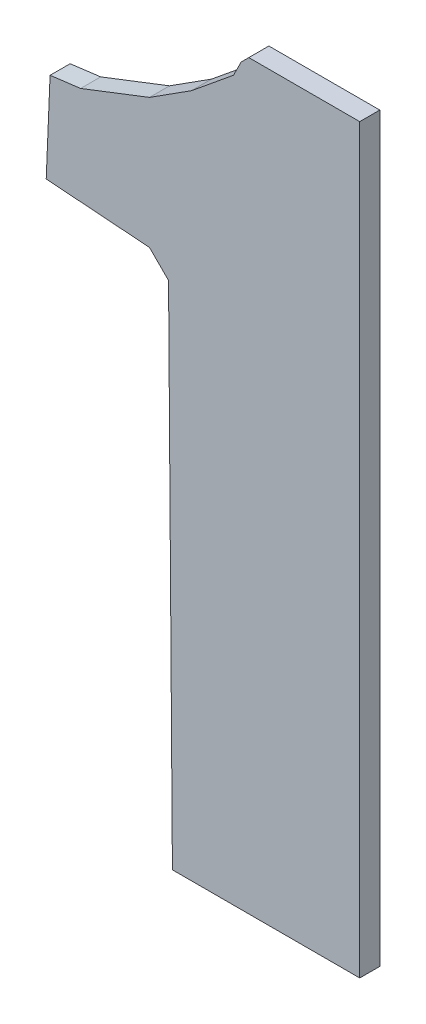
ISO-10303-21;
HEADER;
FILE_DESCRIPTION(('STEP AP214'),'2;1');
FILE_NAME('part.step','',(''),(''),'','','');
FILE_SCHEMA(('AUTOMOTIVE_DESIGN { 1 0 10303 214 1 1 1 1 }'));
ENDSEC;
DATA;
#1=APPLICATION_CONTEXT('core data for automotive mechanical design processes');
#2=APPLICATION_PROTOCOL_DEFINITION('international standard','automotive_design',2000,#1);
#3=PRODUCT_CONTEXT('',#1,'mechanical');
#4=PRODUCT('Part','Part','',(#3));
#5=PRODUCT_RELATED_PRODUCT_CATEGORY('part','',(#4));
#6=PRODUCT_DEFINITION_FORMATION('','',#4);
#7=PRODUCT_DEFINITION_CONTEXT('part definition',#1,'design');
#8=PRODUCT_DEFINITION('design','',#6,#7);
#9=PRODUCT_DEFINITION_SHAPE('','',#8);
#10=(LENGTH_UNIT() NAMED_UNIT(*) SI_UNIT(.MILLI.,.METRE.));
#11=(NAMED_UNIT(*) PLANE_ANGLE_UNIT() SI_UNIT($,.RADIAN.));
#12=(NAMED_UNIT(*) SI_UNIT($,.STERADIAN.) SOLID_ANGLE_UNIT());
#13=UNCERTAINTY_MEASURE_WITH_UNIT(LENGTH_MEASURE(1.E-05),#10,'distance_accuracy_value','');
#14=(GEOMETRIC_REPRESENTATION_CONTEXT(3) GLOBAL_UNCERTAINTY_ASSIGNED_CONTEXT((#13)) GLOBAL_UNIT_ASSIGNED_CONTEXT((#10,
#11,#12)) REPRESENTATION_CONTEXT('',''));
#15=CARTESIAN_POINT('',(0.,0.,0.));
#16=DIRECTION('',(0.,0.,1.));
#17=DIRECTION('',(1.,0.,0.));
#18=AXIS2_PLACEMENT_3D('',#15,#16,#17);
#19=CARTESIAN_POINT('',(0.,0.,0.05));
#20=DIRECTION('',(0.,0.,1.));
#21=DIRECTION('',(1.,0.,0.));
#22=AXIS2_PLACEMENT_3D('',#19,#20,#21);
#23=PLANE('',#22);
#24=DIRECTION('',(-0.842902467487739,-0.538066380944844,0.));
#25=VECTOR('',#24,1.);
#26=CARTESIAN_POINT('',(-0.67691,0.910336,0.05));
#27=LINE('',#26,#25);
#28=CARTESIAN_POINT('',(-0.676910000000001,0.910336000000001,0.05));
#29=VERTEX_POINT('',#28);
#30=CARTESIAN_POINT('',(-0.781558,0.843534000000001,0.05));
#31=VERTEX_POINT('',#30);
#32=EDGE_CURVE('E135',#29,#31,#27,.T.);
#33=ORIENTED_EDGE('',*,*,#32,.T.);
#34=DIRECTION('',(-0.932418227921284,-0.361381029164694,0.));
#35=VECTOR('',#34,1.);
#36=CARTESIAN_POINT('',(-0.781558,0.843534,0.05));
#37=LINE('',#36,#35);
#38=CARTESIAN_POINT('',(-0.953262000000001,0.776986000000003,0.05));
#39=VERTEX_POINT('',#38);
#40=EDGE_CURVE('E137',#39,#31,#37,.F.);
#41=ORIENTED_EDGE('',*,*,#40,.F.);
#42=DIRECTION('',(-0.992073039017614,-0.125662584942202,0.));
#43=VECTOR('',#42,1.);
#44=CARTESIAN_POINT('',(-0.953262,0.776986,0.05));
#45=LINE('',#44,#43);
#46=CARTESIAN_POINT('',(-1.029462,0.767334000000001,0.05));
#47=VERTEX_POINT('',#46);
#48=EDGE_CURVE('E140',#47,#39,#45,.F.);
#49=ORIENTED_EDGE('',*,*,#48,.F.);
#50=DIRECTION('',(-0.0421379007327119,-0.999111804215044,0.));
#51=VECTOR('',#50,1.);
#52=CARTESIAN_POINT('',(-1.029462,0.767334,0.05));
#53=LINE('',#52,#51);
#54=CARTESIAN_POINT('',(-1.039114,0.53848,0.05));
#55=VERTEX_POINT('',#54);
#56=EDGE_CURVE('E144',#55,#47,#53,.F.);
#57=ORIENTED_EDGE('',*,*,#56,.F.);
#58=DIRECTION('',(0.997275799066995,-0.0737630028895696,0.));
#59=VECTOR('',#58,1.);
#60=CARTESIAN_POINT('',(-1.039114,0.53848,0.05));
#61=LINE('',#60,#59);
#62=CARTESIAN_POINT('',(-0.781558,0.51943,0.05));
#63=VERTEX_POINT('',#62);
#64=EDGE_CURVE('E148',#63,#55,#61,.F.);
#65=ORIENTED_EDGE('',*,*,#64,.F.);
#66=DIRECTION('',(0.707106781186548,-0.707106781186548,0.));
#67=VECTOR('',#66,1.);
#68=CARTESIAN_POINT('',(-0.781558,0.51943,0.05));
#69=LINE('',#68,#67);
#70=CARTESIAN_POINT('',(-0.73406,0.471932,0.05));
#71=VERTEX_POINT('',#70);
#72=EDGE_CURVE('E152',#71,#63,#69,.F.);
#73=ORIENTED_EDGE('',*,*,#72,.F.);
#74=DIRECTION('',(0.0076119589518409,-0.999971028620787,0.));
#75=VECTOR('',#74,1.);
#76=CARTESIAN_POINT('',(-0.73406,0.471932,0.05));
#77=LINE('',#76,#75);
#78=CARTESIAN_POINT('',(-0.724408,-0.796036,0.05));
#79=VERTEX_POINT('',#78);
#80=EDGE_CURVE('E156',#79,#71,#77,.F.);
#81=ORIENTED_EDGE('',*,*,#80,.F.);
#82=DIRECTION('',(1.,0.,0.));
#83=VECTOR('',#82,1.);
#84=CARTESIAN_POINT('',(-0.724408,-0.796036,0.05));
#85=LINE('',#84,#83);
#86=CARTESIAN_POINT('',(-0.257302,-0.796036,0.05));
#87=VERTEX_POINT('',#86);
#88=EDGE_CURVE('E160',#87,#79,#85,.F.);
#89=ORIENTED_EDGE('',*,*,#88,.F.);
#90=DIRECTION('',(0.,1.,0.));
#91=VECTOR('',#90,1.);
#92=CARTESIAN_POINT('',(-0.257302,-0.796036,0.05));
#93=LINE('',#92,#91);
#94=CARTESIAN_POINT('',(-0.257302,1.053338,0.05));
#95=VERTEX_POINT('',#94);
#96=EDGE_CURVE('E114',#95,#87,#93,.F.);
#97=ORIENTED_EDGE('',*,*,#96,.F.);
#98=DIRECTION('',(1.,0.,0.));
#99=VECTOR('',#98,1.);
#100=CARTESIAN_POINT('',(0.,1.053338,0.05));
#101=LINE('',#100,#99);
#102=CARTESIAN_POINT('',(-0.533908,1.053338,0.05));
#103=VERTEX_POINT('',#102);
#104=EDGE_CURVE('E20',#95,#103,#101,.F.);
#105=ORIENTED_EDGE('',*,*,#104,.T.);
#106=DIRECTION('',(-0.707106781186545,-0.70710678118655,0.));
#107=VECTOR('',#106,1.);
#108=CARTESIAN_POINT('',(-0.533908,1.053338,0.05));
#109=LINE('',#108,#107);
#110=CARTESIAN_POINT('',(-0.552958,1.034288,0.05));
#111=VERTEX_POINT('',#110);
#112=EDGE_CURVE('E109',#103,#111,#109,.T.);
#113=ORIENTED_EDGE('',*,*,#112,.T.);
#114=DIRECTION('',(-0.447213595499956,-0.894427190999917,0.));
#115=VECTOR('',#114,1.);
#116=CARTESIAN_POINT('',(-0.552958,1.034288,0.05));
#117=LINE('',#116,#115);
#118=CARTESIAN_POINT('',(-0.572008,0.996188,0.05));
#119=VERTEX_POINT('',#118);
#120=EDGE_CURVE('E130',#111,#119,#117,.T.);
#121=ORIENTED_EDGE('',*,*,#120,.T.);
#122=DIRECTION('',(-0.773873806941793,-0.633339822630329,0.));
#123=VECTOR('',#122,1.);
#124=CARTESIAN_POINT('',(-0.572008,0.996188,0.05));
#125=LINE('',#124,#123);
#126=EDGE_CURVE('E131',#119,#29,#125,.T.);
#127=ORIENTED_EDGE('',*,*,#126,.T.);
#128=EDGE_LOOP('',(#33,#41,#49,#57,#65,#73,#81,#89,#97,#105,#113,#121,#127));
#129=FACE_BOUND('',#128,.T.);
#130=ADVANCED_FACE('F17',(#129),#23,.T.);
#131=CARTESIAN_POINT('',(-0.781558,0.843534,0.));
#132=DIRECTION('',(-0.361381029164694,0.932418227921284,0.));
#133=DIRECTION('',(-0.932418227921284,-0.361381029164694,0.));
#134=AXIS2_PLACEMENT_3D('',#131,#132,#133);
#135=PLANE('',#134);
#136=DIRECTION('',(0.,0.,1.));
#137=VECTOR('',#136,1.);
#138=CARTESIAN_POINT('',(-0.781558000000001,0.843534000000002,0.));
#139=LINE('',#138,#137);
#140=CARTESIAN_POINT('',(-0.781558000000001,0.843534,0.));
#141=VERTEX_POINT('',#140);
#142=EDGE_CURVE('E171',#141,#31,#139,.T.);
#143=ORIENTED_EDGE('',*,*,#142,.F.);
#144=DIRECTION('',(-0.932418227921262,-0.36138102916475,0.));
#145=VECTOR('',#144,1.);
#146=CARTESIAN_POINT('',(-0.781558,0.843534,0.));
#147=LINE('',#146,#145);
#148=CARTESIAN_POINT('',(-0.953262000000002,0.776986000000005,0.));
#149=VERTEX_POINT('',#148);
#150=EDGE_CURVE('E175',#141,#149,#147,.T.);
#151=ORIENTED_EDGE('',*,*,#150,.T.);
#152=DIRECTION('',(0.,0.,1.));
#153=VECTOR('',#152,1.);
#154=CARTESIAN_POINT('',(-0.953262,0.776986,0.));
#155=LINE('',#154,#153);
#156=EDGE_CURVE('E142',#39,#149,#155,.F.);
#157=ORIENTED_EDGE('',*,*,#156,.F.);
#158=ORIENTED_EDGE('',*,*,#40,.T.);
#159=EDGE_LOOP('',(#143,#151,#157,#158));
#160=FACE_BOUND('',#159,.T.);
#161=ADVANCED_FACE('F221',(#160),#135,.T.);
#162=CARTESIAN_POINT('',(-0.953262,0.776986,0.));
#163=DIRECTION('',(-0.125662584942202,0.992073039017614,0.));
#164=DIRECTION('',(-0.992073039017614,-0.125662584942202,0.));
#165=AXIS2_PLACEMENT_3D('',#162,#163,#164);
#166=PLANE('',#165);
#167=ORIENTED_EDGE('',*,*,#156,.T.);
#168=DIRECTION('',(-0.99207303901761,-0.125662584942232,0.));
#169=VECTOR('',#168,1.);
#170=CARTESIAN_POINT('',(-0.953262,0.776986,0.));
#171=LINE('',#170,#169);
#172=CARTESIAN_POINT('',(-1.029462,0.767334000000001,0.));
#173=VERTEX_POINT('',#172);
#174=EDGE_CURVE('E178',#149,#173,#171,.T.);
#175=ORIENTED_EDGE('',*,*,#174,.T.);
#176=DIRECTION('',(0.,0.,1.));
#177=VECTOR('',#176,1.);
#178=CARTESIAN_POINT('',(-1.029462,0.767334,0.));
#179=LINE('',#178,#177);
#180=EDGE_CURVE('E146',#47,#173,#179,.F.);
#181=ORIENTED_EDGE('',*,*,#180,.F.);
#182=ORIENTED_EDGE('',*,*,#48,.T.);
#183=EDGE_LOOP('',(#167,#175,#181,#182));
#184=FACE_BOUND('',#183,.T.);
#185=ADVANCED_FACE('F262',(#184),#166,.T.);
#186=CARTESIAN_POINT('',(-1.029462,0.767334,0.));
#187=DIRECTION('',(-0.999111804215044,0.0421379007327119,0.));
#188=DIRECTION('',(-0.0421379007327119,-0.999111804215044,0.));
#189=AXIS2_PLACEMENT_3D('',#186,#187,#188);
#190=PLANE('',#189);
#191=ORIENTED_EDGE('',*,*,#180,.T.);
#192=DIRECTION('',(-0.0421379007327098,-0.999111804215044,0.));
#193=VECTOR('',#192,1.);
#194=CARTESIAN_POINT('',(-1.029462,0.767334,0.));
#195=LINE('',#194,#193);
#196=CARTESIAN_POINT('',(-1.039114,0.53848,0.));
#197=VERTEX_POINT('',#196);
#198=EDGE_CURVE('E181',#173,#197,#195,.T.);
#199=ORIENTED_EDGE('',*,*,#198,.T.);
#200=DIRECTION('',(0.,0.,1.));
#201=VECTOR('',#200,1.);
#202=CARTESIAN_POINT('',(-1.039114,0.53848,0.));
#203=LINE('',#202,#201);
#204=EDGE_CURVE('E150',#55,#197,#203,.F.);
#205=ORIENTED_EDGE('',*,*,#204,.F.);
#206=ORIENTED_EDGE('',*,*,#56,.T.);
#207=EDGE_LOOP('',(#191,#199,#205,#206));
#208=FACE_BOUND('',#207,.T.);
#209=ADVANCED_FACE('F258',(#208),#190,.T.);
#210=CARTESIAN_POINT('',(-1.039114,0.53848,0.));
#211=DIRECTION('',(-0.0737630028895696,-0.997275799066995,0.));
#212=DIRECTION('',(0.997275799066995,-0.0737630028895696,0.));
#213=AXIS2_PLACEMENT_3D('',#210,#211,#212);
#214=PLANE('',#213);
#215=ORIENTED_EDGE('',*,*,#204,.T.);
#216=DIRECTION('',(0.997275799066995,-0.0737630028895704,0.));
#217=VECTOR('',#216,1.);
#218=CARTESIAN_POINT('',(-1.039114,0.53848,0.));
#219=LINE('',#218,#217);
#220=CARTESIAN_POINT('',(-0.781558,0.51943,0.));
#221=VERTEX_POINT('',#220);
#222=EDGE_CURVE('E184',#197,#221,#219,.T.);
#223=ORIENTED_EDGE('',*,*,#222,.T.);
#224=DIRECTION('',(0.,0.,1.));
#225=VECTOR('',#224,1.);
#226=CARTESIAN_POINT('',(-0.781558,0.51943,0.));
#227=LINE('',#226,#225);
#228=EDGE_CURVE('E154',#63,#221,#227,.F.);
#229=ORIENTED_EDGE('',*,*,#228,.F.);
#230=ORIENTED_EDGE('',*,*,#64,.T.);
#231=EDGE_LOOP('',(#215,#223,#229,#230));
#232=FACE_BOUND('',#231,.T.);
#233=ADVANCED_FACE('F254',(#232),#214,.T.);
#234=CARTESIAN_POINT('',(-0.781558,0.51943,0.));
#235=DIRECTION('',(-0.707106781186548,-0.707106781186548,0.));
#236=DIRECTION('',(0.707106781186548,-0.707106781186548,0.));
#237=AXIS2_PLACEMENT_3D('',#234,#235,#236);
#238=PLANE('',#237);
#239=ORIENTED_EDGE('',*,*,#228,.T.);
#240=DIRECTION('',(0.707106781186548,-0.707106781186547,0.));
#241=VECTOR('',#240,1.);
#242=CARTESIAN_POINT('',(-0.781558,0.51943,0.));
#243=LINE('',#242,#241);
#244=CARTESIAN_POINT('',(-0.73406,0.471932,0.));
#245=VERTEX_POINT('',#244);
#246=EDGE_CURVE('E187',#221,#245,#243,.T.);
#247=ORIENTED_EDGE('',*,*,#246,.T.);
#248=DIRECTION('',(0.,0.,1.));
#249=VECTOR('',#248,1.);
#250=CARTESIAN_POINT('',(-0.73406,0.471932,0.));
#251=LINE('',#250,#249);
#252=EDGE_CURVE('E158',#71,#245,#251,.F.);
#253=ORIENTED_EDGE('',*,*,#252,.F.);
#254=ORIENTED_EDGE('',*,*,#72,.T.);
#255=EDGE_LOOP('',(#239,#247,#253,#254));
#256=FACE_BOUND('',#255,.T.);
#257=ADVANCED_FACE('F250',(#256),#238,.T.);
#258=CARTESIAN_POINT('',(-0.73406,0.471932,0.));
#259=DIRECTION('',(-0.999971028620787,-0.0076119589518409,0.));
#260=DIRECTION('',(0.0076119589518409,-0.999971028620787,0.));
#261=AXIS2_PLACEMENT_3D('',#258,#259,#260);
#262=PLANE('',#261);
#263=ORIENTED_EDGE('',*,*,#252,.T.);
#264=DIRECTION('',(0.0076119589518409,-0.999971028620787,0.));
#265=VECTOR('',#264,1.);
#266=CARTESIAN_POINT('',(-0.73406,0.471932,0.));
#267=LINE('',#266,#265);
#268=CARTESIAN_POINT('',(-0.724408,-0.796036,0.));
#269=VERTEX_POINT('',#268);
#270=EDGE_CURVE('E190',#245,#269,#267,.T.);
#271=ORIENTED_EDGE('',*,*,#270,.T.);
#272=DIRECTION('',(0.,0.,-1.));
#273=VECTOR('',#272,1.);
#274=CARTESIAN_POINT('',(-0.724408,-0.796036,0.));
#275=LINE('',#274,#273);
#276=EDGE_CURVE('E162',#79,#269,#275,.T.);
#277=ORIENTED_EDGE('',*,*,#276,.F.);
#278=ORIENTED_EDGE('',*,*,#80,.T.);
#279=EDGE_LOOP('',(#263,#271,#277,#278));
#280=FACE_BOUND('',#279,.T.);
#281=ADVANCED_FACE('F246',(#280),#262,.T.);
#282=CARTESIAN_POINT('',(-0.724408,-0.796036,0.));
#283=DIRECTION('',(0.,-1.,0.));
#284=DIRECTION('',(0.,0.,-1.));
#285=AXIS2_PLACEMENT_3D('',#282,#283,#284);
#286=PLANE('',#285);
#287=ORIENTED_EDGE('',*,*,#276,.T.);
#288=DIRECTION('',(1.,0.,0.));
#289=VECTOR('',#288,1.);
#290=CARTESIAN_POINT('',(0.,-0.796036,0.));
#291=LINE('',#290,#289);
#292=CARTESIAN_POINT('',(-0.257302,-0.796036,0.));
#293=VERTEX_POINT('',#292);
#294=EDGE_CURVE('E193',#269,#293,#291,.T.);
#295=ORIENTED_EDGE('',*,*,#294,.T.);
#296=DIRECTION('',(0.,0.,-1.));
#297=VECTOR('',#296,1.);
#298=CARTESIAN_POINT('',(-0.257302,-0.796036,0.));
#299=LINE('',#298,#297);
#300=EDGE_CURVE('E165',#87,#293,#299,.T.);
#301=ORIENTED_EDGE('',*,*,#300,.F.);
#302=ORIENTED_EDGE('',*,*,#88,.T.);
#303=EDGE_LOOP('',(#287,#295,#301,#302));
#304=FACE_BOUND('',#303,.T.);
#305=ADVANCED_FACE('F242',(#304),#286,.T.);
#306=CARTESIAN_POINT('',(-0.257302,-0.796036,0.));
#307=DIRECTION('',(1.,0.,0.));
#308=DIRECTION('',(0.,0.,-1.));
#309=AXIS2_PLACEMENT_3D('',#306,#307,#308);
#310=PLANE('',#309);
#311=ORIENTED_EDGE('',*,*,#300,.T.);
#312=DIRECTION('',(0.,1.,0.));
#313=VECTOR('',#312,1.);
#314=CARTESIAN_POINT('',(-0.257302,0.,0.));
#315=LINE('',#314,#313);
#316=CARTESIAN_POINT('',(-0.257302,1.053338,0.));
#317=VERTEX_POINT('',#316);
#318=EDGE_CURVE('E196',#293,#317,#315,.T.);
#319=ORIENTED_EDGE('',*,*,#318,.T.);
#320=DIRECTION('',(0.,0.,1.));
#321=VECTOR('',#320,1.);
#322=CARTESIAN_POINT('',(-0.257302,1.053338,0.));
#323=LINE('',#322,#321);
#324=EDGE_CURVE('E126',#95,#317,#323,.F.);
#325=ORIENTED_EDGE('',*,*,#324,.F.);
#326=ORIENTED_EDGE('',*,*,#96,.T.);
#327=EDGE_LOOP('',(#311,#319,#325,#326));
#328=FACE_BOUND('',#327,.T.);
#329=ADVANCED_FACE('F239',(#328),#310,.T.);
#330=CARTESIAN_POINT('',(-0.257302,1.053338,0.));
#331=DIRECTION('',(0.,1.,0.));
#332=DIRECTION('',(0.,0.,1.));
#333=AXIS2_PLACEMENT_3D('',#330,#331,#332);
#334=PLANE('',#333);
#335=ORIENTED_EDGE('',*,*,#324,.T.);
#336=DIRECTION('',(1.,0.,0.));
#337=VECTOR('',#336,1.);
#338=CARTESIAN_POINT('',(0.,1.053338,0.));
#339=LINE('',#338,#337);
#340=CARTESIAN_POINT('',(-0.533908,1.053338,0.));
#341=VERTEX_POINT('',#340);
#342=EDGE_CURVE('E121',#317,#341,#339,.F.);
#343=ORIENTED_EDGE('',*,*,#342,.T.);
#344=DIRECTION('',(0.,0.,1.));
#345=VECTOR('',#344,1.);
#346=CARTESIAN_POINT('',(-0.533908,1.053338,0.));
#347=LINE('',#346,#345);
#348=EDGE_CURVE('E118',#103,#341,#347,.F.);
#349=ORIENTED_EDGE('',*,*,#348,.F.);
#350=ORIENTED_EDGE('',*,*,#104,.F.);
#351=EDGE_LOOP('',(#335,#343,#349,#350));
#352=FACE_BOUND('',#351,.T.);
#353=ADVANCED_FACE('F119',(#352),#334,.T.);
#354=CARTESIAN_POINT('',(-0.533908,1.053338,0.));
#355=DIRECTION('',(-0.707106781186548,0.707106781186548,0.));
#356=DIRECTION('',(-0.707106781186548,-0.707106781186548,0.));
#357=AXIS2_PLACEMENT_3D('',#354,#355,#356);
#358=PLANE('',#357);
#359=ORIENTED_EDGE('',*,*,#348,.T.);
#360=DIRECTION('',(-0.707106781186545,-0.70710678118655,0.));
#361=VECTOR('',#360,1.);
#362=CARTESIAN_POINT('',(-0.533908,1.053338,0.));
#363=LINE('',#362,#361);
#364=CARTESIAN_POINT('',(-0.552958,1.034288,0.));
#365=VERTEX_POINT('',#364);
#366=EDGE_CURVE('E200',#341,#365,#363,.T.);
#367=ORIENTED_EDGE('',*,*,#366,.T.);
#368=DIRECTION('',(0.,0.,1.));
#369=VECTOR('',#368,1.);
#370=CARTESIAN_POINT('',(-0.552958,1.034288,0.));
#371=LINE('',#370,#369);
#372=EDGE_CURVE('E125',#111,#365,#371,.F.);
#373=ORIENTED_EDGE('',*,*,#372,.F.);
#374=ORIENTED_EDGE('',*,*,#112,.F.);
#375=EDGE_LOOP('',(#359,#367,#373,#374));
#376=FACE_BOUND('',#375,.T.);
#377=ADVANCED_FACE('F128',(#376),#358,.T.);
#378=CARTESIAN_POINT('',(-0.552958,1.034288,0.));
#379=DIRECTION('',(-0.894427190999896,0.447213595499998,0.));
#380=DIRECTION('',(-0.447213595499998,-0.894427190999896,0.));
#381=AXIS2_PLACEMENT_3D('',#378,#379,#380);
#382=PLANE('',#381);
#383=ORIENTED_EDGE('',*,*,#372,.T.);
#384=DIRECTION('',(-0.447213595499956,-0.894427190999917,0.));
#385=VECTOR('',#384,1.);
#386=CARTESIAN_POINT('',(-0.552958,1.034288,0.));
#387=LINE('',#386,#385);
#388=CARTESIAN_POINT('',(-0.572008000000001,0.996188000000001,0.));
#389=VERTEX_POINT('',#388);
#390=EDGE_CURVE('E202',#365,#389,#387,.T.);
#391=ORIENTED_EDGE('',*,*,#390,.T.);
#392=DIRECTION('',(0.,0.,1.));
#393=VECTOR('',#392,1.);
#394=CARTESIAN_POINT('',(-0.572008,0.996188,0.));
#395=LINE('',#394,#393);
#396=EDGE_CURVE('E169',#119,#389,#395,.F.);
#397=ORIENTED_EDGE('',*,*,#396,.F.);
#398=ORIENTED_EDGE('',*,*,#120,.F.);
#399=EDGE_LOOP('',(#383,#391,#397,#398));
#400=FACE_BOUND('',#399,.T.);
#401=ADVANCED_FACE('F215',(#400),#382,.T.);
#402=CARTESIAN_POINT('',(-0.572008,0.996188,0.));
#403=DIRECTION('',(-0.633339822630308,0.77387380694181,0.));
#404=DIRECTION('',(-0.77387380694181,-0.633339822630308,0.));
#405=AXIS2_PLACEMENT_3D('',#402,#403,#404);
#406=PLANE('',#405);
#407=ORIENTED_EDGE('',*,*,#396,.T.);
#408=DIRECTION('',(-0.773873806941793,-0.633339822630329,0.));
#409=VECTOR('',#408,1.);
#410=CARTESIAN_POINT('',(-0.572008,0.996188,0.));
#411=LINE('',#410,#409);
#412=CARTESIAN_POINT('',(-0.676910000000001,0.910336000000001,0.));
#413=VERTEX_POINT('',#412);
#414=EDGE_CURVE('E26',#389,#413,#411,.T.);
#415=ORIENTED_EDGE('',*,*,#414,.T.);
#416=DIRECTION('',(0.,0.,1.));
#417=VECTOR('',#416,1.);
#418=CARTESIAN_POINT('',(-0.67691,0.910336,0.));
#419=LINE('',#418,#417);
#420=EDGE_CURVE('E34',#29,#413,#419,.F.);
#421=ORIENTED_EDGE('',*,*,#420,.F.);
#422=ORIENTED_EDGE('',*,*,#126,.F.);
#423=EDGE_LOOP('',(#407,#415,#421,#422));
#424=FACE_BOUND('',#423,.T.);
#425=ADVANCED_FACE('F208',(#424),#406,.T.);
#426=CARTESIAN_POINT('',(-0.67691,0.910336,0.));
#427=DIRECTION('',(-0.53806638094483,0.842902467487747,0.));
#428=DIRECTION('',(-0.842902467487747,-0.53806638094483,0.));
#429=AXIS2_PLACEMENT_3D('',#426,#427,#428);
#430=PLANE('',#429);
#431=ORIENTED_EDGE('',*,*,#420,.T.);
#432=DIRECTION('',(-0.842902467487739,-0.538066380944844,0.));
#433=VECTOR('',#432,1.);
#434=CARTESIAN_POINT('',(-0.67691,0.910336,0.));
#435=LINE('',#434,#433);
#436=EDGE_CURVE('E11',#413,#141,#435,.T.);
#437=ORIENTED_EDGE('',*,*,#436,.T.);
#438=ORIENTED_EDGE('',*,*,#142,.T.);
#439=ORIENTED_EDGE('',*,*,#32,.F.);
#440=EDGE_LOOP('',(#431,#437,#438,#439));
#441=FACE_BOUND('',#440,.T.);
#442=ADVANCED_FACE('F222',(#441),#430,.T.);
#443=CARTESIAN_POINT('',(0.,0.,0.));
#444=DIRECTION('',(0.,0.,1.));
#445=DIRECTION('',(1.,0.,0.));
#446=AXIS2_PLACEMENT_3D('',#443,#444,#445);
#447=PLANE('',#446);
#448=ORIENTED_EDGE('',*,*,#414,.F.);
#449=ORIENTED_EDGE('',*,*,#390,.F.);
#450=ORIENTED_EDGE('',*,*,#366,.F.);
#451=ORIENTED_EDGE('',*,*,#342,.F.);
#452=ORIENTED_EDGE('',*,*,#318,.F.);
#453=ORIENTED_EDGE('',*,*,#294,.F.);
#454=ORIENTED_EDGE('',*,*,#270,.F.);
#455=ORIENTED_EDGE('',*,*,#246,.F.);
#456=ORIENTED_EDGE('',*,*,#222,.F.);
#457=ORIENTED_EDGE('',*,*,#198,.F.);
#458=ORIENTED_EDGE('',*,*,#174,.F.);
#459=ORIENTED_EDGE('',*,*,#150,.F.);
#460=ORIENTED_EDGE('',*,*,#436,.F.);
#461=EDGE_LOOP('',(#448,#449,#450,#451,#452,#453,#454,#455,#456,#457,#458,#459,#460));
#462=FACE_BOUND('',#461,.T.);
#463=ADVANCED_FACE('F213',(#462),#447,.F.);
#464=CLOSED_SHELL('',(#130,#161,#185,#209,#233,#257,#281,#305,#329,#353,#377,#401,#425,#442,#463));
#465=MANIFOLD_SOLID_BREP('B1',#464);
#466=ADVANCED_BREP_SHAPE_REPRESENTATION('',(#18,#465),#14);
#467=SHAPE_DEFINITION_REPRESENTATION(#9,#466);
ENDSEC;
END-ISO-10303-21;
